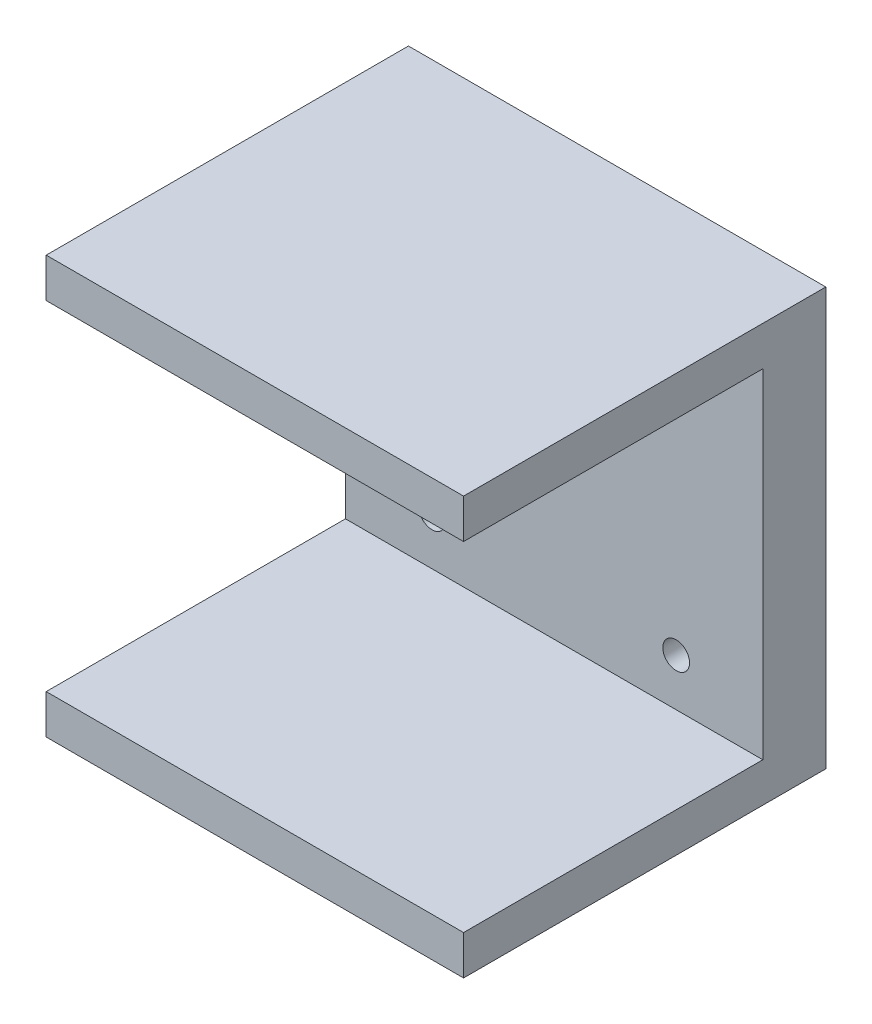
ISO-10303-21;
HEADER;
FILE_DESCRIPTION(('STEP AP214'),'2;1');
FILE_NAME('part.step','',(''),(''),'','','');
FILE_SCHEMA(('AUTOMOTIVE_DESIGN { 1 0 10303 214 1 1 1 1 }'));
ENDSEC;
DATA;
#1=APPLICATION_CONTEXT('core data for automotive mechanical design processes');
#2=APPLICATION_PROTOCOL_DEFINITION('international standard','automotive_design',2000,#1);
#3=PRODUCT_CONTEXT('',#1,'mechanical');
#4=PRODUCT('Part','Part','',(#3));
#5=PRODUCT_RELATED_PRODUCT_CATEGORY('part','',(#4));
#6=PRODUCT_DEFINITION_FORMATION('','',#4);
#7=PRODUCT_DEFINITION_CONTEXT('part definition',#1,'design');
#8=PRODUCT_DEFINITION('design','',#6,#7);
#9=PRODUCT_DEFINITION_SHAPE('','',#8);
#10=(LENGTH_UNIT() NAMED_UNIT(*) SI_UNIT(.MILLI.,.METRE.));
#11=(NAMED_UNIT(*) PLANE_ANGLE_UNIT() SI_UNIT($,.RADIAN.));
#12=(NAMED_UNIT(*) SI_UNIT($,.STERADIAN.) SOLID_ANGLE_UNIT());
#13=UNCERTAINTY_MEASURE_WITH_UNIT(LENGTH_MEASURE(1.E-05),#10,'distance_accuracy_value','');
#14=(GEOMETRIC_REPRESENTATION_CONTEXT(3) GLOBAL_UNCERTAINTY_ASSIGNED_CONTEXT((#13)) GLOBAL_UNIT_ASSIGNED_CONTEXT((#10,
#11,#12)) REPRESENTATION_CONTEXT('',''));
#15=CARTESIAN_POINT('',(0.,0.,0.));
#16=DIRECTION('',(0.,0.,1.));
#17=DIRECTION('',(1.,0.,0.));
#18=AXIS2_PLACEMENT_3D('',#15,#16,#17);
#19=CARTESIAN_POINT('',(0.,0.,0.));
#20=DIRECTION('',(0.,0.,-1.));
#21=DIRECTION('',(-1.,0.,0.));
#22=AXIS2_PLACEMENT_3D('',#19,#20,#21);
#23=PLANE('',#22);
#24=CARTESIAN_POINT('',(15.5,-15.5,0.));
#25=DIRECTION('',(0.,0.,-1.));
#26=DIRECTION('',(-1.,0.,0.));
#27=AXIS2_PLACEMENT_3D('',#24,#25,#26);
#28=CIRCLE('',#27,1.7);
#29=CARTESIAN_POINT('',(13.8,-15.5,0.));
#30=VERTEX_POINT('',#29);
#31=EDGE_CURVE('E157',#30,#30,#28,.T.);
#32=ORIENTED_EDGE('',*,*,#31,.F.);
#33=EDGE_LOOP('',(#32));
#34=FACE_BOUND('',#33,.T.);
#35=CARTESIAN_POINT('',(15.4999999999999,-15.4999999999999,0.));
#36=DIRECTION('',(0.,0.,1.));
#37=DIRECTION('',(-1.,0.,0.));
#38=AXIS2_PLACEMENT_3D('',#35,#36,#37);
#39=CIRCLE('',#38,2.94999999999999);
#40=CARTESIAN_POINT('',(12.5499999999999,-15.4999999999999,0.));
#41=VERTEX_POINT('',#40);
#42=EDGE_CURVE('E11',#41,#41,#39,.T.);
#43=ORIENTED_EDGE('',*,*,#42,.F.);
#44=EDGE_LOOP('',(#43));
#45=FACE_BOUND('',#44,.T.);
#46=ADVANCED_FACE('F42',(#34,#45),#23,.T.);
#47=CARTESIAN_POINT('',(-15.5,-15.5,0.));
#48=DIRECTION('',(0.,0.,-1.));
#49=DIRECTION('',(-1.,0.,0.));
#50=AXIS2_PLACEMENT_3D('',#47,#48,#49);
#51=CIRCLE('',#50,1.7);
#52=CARTESIAN_POINT('',(-17.2,-15.5,0.));
#53=VERTEX_POINT('',#52);
#54=EDGE_CURVE('E153',#53,#53,#51,.T.);
#55=ORIENTED_EDGE('',*,*,#54,.F.);
#56=EDGE_LOOP('',(#55));
#57=FACE_BOUND('',#56,.T.);
#58=CARTESIAN_POINT('',(-15.4999999999999,-15.4999999999999,0.));
#59=DIRECTION('',(0.,0.,1.));
#60=DIRECTION('',(-1.,0.,0.));
#61=AXIS2_PLACEMENT_3D('',#58,#59,#60);
#62=CIRCLE('',#61,2.95);
#63=CARTESIAN_POINT('',(-18.4499999999999,-15.4999999999999,0.));
#64=VERTEX_POINT('',#63);
#65=EDGE_CURVE('E52',#64,#64,#62,.T.);
#66=ORIENTED_EDGE('',*,*,#65,.F.);
#67=EDGE_LOOP('',(#66));
#68=FACE_BOUND('',#67,.T.);
#69=ADVANCED_FACE('F284',(#57,#68),#23,.T.);
#70=CARTESIAN_POINT('',(-15.5,15.5,0.));
#71=DIRECTION('',(0.,0.,-1.));
#72=DIRECTION('',(-1.,0.,0.));
#73=AXIS2_PLACEMENT_3D('',#70,#71,#72);
#74=CIRCLE('',#73,1.7);
#75=CARTESIAN_POINT('',(-17.2,15.5,0.));
#76=VERTEX_POINT('',#75);
#77=EDGE_CURVE('E158',#76,#76,#74,.T.);
#78=ORIENTED_EDGE('',*,*,#77,.F.);
#79=EDGE_LOOP('',(#78));
#80=FACE_BOUND('',#79,.T.);
#81=CARTESIAN_POINT('',(-15.4999999999999,15.4999999999999,0.));
#82=DIRECTION('',(0.,0.,1.));
#83=DIRECTION('',(1.,0.,0.));
#84=AXIS2_PLACEMENT_3D('',#81,#82,#83);
#85=CIRCLE('',#84,2.95);
#86=CARTESIAN_POINT('',(-12.5499999999999,15.4999999999999,0.));
#87=VERTEX_POINT('',#86);
#88=EDGE_CURVE('E247',#87,#87,#85,.T.);
#89=ORIENTED_EDGE('',*,*,#88,.F.);
#90=EDGE_LOOP('',(#89));
#91=FACE_BOUND('',#90,.T.);
#92=ADVANCED_FACE('F291',(#80,#91),#23,.T.);
#93=CARTESIAN_POINT('',(15.5,15.5,0.));
#94=DIRECTION('',(0.,0.,-1.));
#95=DIRECTION('',(-1.,0.,0.));
#96=AXIS2_PLACEMENT_3D('',#93,#94,#95);
#97=CIRCLE('',#96,1.7);
#98=CARTESIAN_POINT('',(13.8,15.5,0.));
#99=VERTEX_POINT('',#98);
#100=EDGE_CURVE('E162',#99,#99,#97,.T.);
#101=ORIENTED_EDGE('',*,*,#100,.F.);
#102=EDGE_LOOP('',(#101));
#103=FACE_BOUND('',#102,.T.);
#104=CARTESIAN_POINT('',(15.4999999999999,15.4999999999999,0.));
#105=DIRECTION('',(0.,0.,1.));
#106=DIRECTION('',(-1.,0.,0.));
#107=AXIS2_PLACEMENT_3D('',#104,#105,#106);
#108=CIRCLE('',#107,2.95);
#109=CARTESIAN_POINT('',(12.5499999999999,15.4999999999999,0.));
#110=VERTEX_POINT('',#109);
#111=EDGE_CURVE('E146',#110,#110,#108,.T.);
#112=ORIENTED_EDGE('',*,*,#111,.F.);
#113=EDGE_LOOP('',(#112));
#114=FACE_BOUND('',#113,.T.);
#115=ADVANCED_FACE('F287',(#103,#114),#23,.T.);
#116=CARTESIAN_POINT('',(26.5,-21.5,5.));
#117=DIRECTION('',(-1.,0.,0.));
#118=DIRECTION('',(0.,0.,1.));
#119=AXIS2_PLACEMENT_3D('',#116,#117,#118);
#120=PLANE('',#119);
#121=DIRECTION('',(0.,0.,-1.));
#122=VECTOR('',#121,1.);
#123=CARTESIAN_POINT('',(26.5,-26.5,43.));
#124=LINE('',#123,#122);
#125=CARTESIAN_POINT('',(26.5,-26.5,43.));
#126=VERTEX_POINT('',#125);
#127=CARTESIAN_POINT('',(26.4999999999998,-26.4999999999998,-3.));
#128=VERTEX_POINT('',#127);
#129=EDGE_CURVE('E136',#126,#128,#124,.T.);
#130=ORIENTED_EDGE('',*,*,#129,.T.);
#131=DIRECTION('',(0.,1.,0.));
#132=VECTOR('',#131,1.);
#133=CARTESIAN_POINT('',(26.4999999999998,26.4999999999998,-3.));
#134=LINE('',#133,#132);
#135=CARTESIAN_POINT('',(26.4999999999998,26.4999999999998,-3.));
#136=VERTEX_POINT('',#135);
#137=EDGE_CURVE('E129',#128,#136,#134,.T.);
#138=ORIENTED_EDGE('',*,*,#137,.T.);
#139=DIRECTION('',(0.,0.,-1.));
#140=VECTOR('',#139,1.);
#141=CARTESIAN_POINT('',(26.5,26.5,43.));
#142=LINE('',#141,#140);
#143=CARTESIAN_POINT('',(26.5,26.5,43.));
#144=VERTEX_POINT('',#143);
#145=EDGE_CURVE('E112',#144,#136,#142,.T.);
#146=ORIENTED_EDGE('',*,*,#145,.F.);
#147=DIRECTION('',(0.,1.,0.));
#148=VECTOR('',#147,1.);
#149=CARTESIAN_POINT('',(26.5,0.,43.));
#150=LINE('',#149,#148);
#151=CARTESIAN_POINT('',(26.5,21.5,43.));
#152=VERTEX_POINT('',#151);
#153=EDGE_CURVE('E220',#152,#144,#150,.T.);
#154=ORIENTED_EDGE('',*,*,#153,.F.);
#155=DIRECTION('',(0.,0.,-1.));
#156=VECTOR('',#155,1.);
#157=CARTESIAN_POINT('',(26.5,21.5,43.));
#158=LINE('',#157,#156);
#159=CARTESIAN_POINT('',(26.5,21.5,5.));
#160=VERTEX_POINT('',#159);
#161=EDGE_CURVE('E121',#152,#160,#158,.T.);
#162=ORIENTED_EDGE('',*,*,#161,.T.);
#163=DIRECTION('',(0.,1.,0.));
#164=VECTOR('',#163,1.);
#165=CARTESIAN_POINT('',(26.5,-21.5,5.));
#166=LINE('',#165,#164);
#167=CARTESIAN_POINT('',(26.5,-21.5,5.));
#168=VERTEX_POINT('',#167);
#169=EDGE_CURVE('E225',#168,#160,#166,.T.);
#170=ORIENTED_EDGE('',*,*,#169,.F.);
#171=DIRECTION('',(0.,0.,-1.));
#172=VECTOR('',#171,1.);
#173=CARTESIAN_POINT('',(26.5,-21.5,43.));
#174=LINE('',#173,#172);
#175=CARTESIAN_POINT('',(26.5,-21.5,43.));
#176=VERTEX_POINT('',#175);
#177=EDGE_CURVE('E60',#176,#168,#174,.T.);
#178=ORIENTED_EDGE('',*,*,#177,.F.);
#179=DIRECTION('',(0.,1.,0.));
#180=VECTOR('',#179,1.);
#181=CARTESIAN_POINT('',(26.5,0.,43.));
#182=LINE('',#181,#180);
#183=EDGE_CURVE('E196',#126,#176,#182,.T.);
#184=ORIENTED_EDGE('',*,*,#183,.F.);
#185=EDGE_LOOP('',(#130,#138,#146,#154,#162,#170,#178,#184));
#186=FACE_BOUND('',#185,.T.);
#187=ADVANCED_FACE('F44',(#186),#120,.F.);
#188=CARTESIAN_POINT('',(-26.5,-21.5,5.));
#189=DIRECTION('',(1.,0.,0.));
#190=DIRECTION('',(0.,0.,-1.));
#191=AXIS2_PLACEMENT_3D('',#188,#189,#190);
#192=PLANE('',#191);
#193=DIRECTION('',(0.,0.,-1.));
#194=VECTOR('',#193,1.);
#195=CARTESIAN_POINT('',(-26.5,26.5,43.));
#196=LINE('',#195,#194);
#197=CARTESIAN_POINT('',(-26.5,26.5,43.));
#198=VERTEX_POINT('',#197);
#199=CARTESIAN_POINT('',(-26.4999999999998,26.4999999999998,-3.));
#200=VERTEX_POINT('',#199);
#201=EDGE_CURVE('E122',#198,#200,#196,.T.);
#202=ORIENTED_EDGE('',*,*,#201,.T.);
#203=DIRECTION('',(0.,-1.,0.));
#204=VECTOR('',#203,1.);
#205=CARTESIAN_POINT('',(-26.4999999999998,26.4999999999998,-3.));
#206=LINE('',#205,#204);
#207=CARTESIAN_POINT('',(-26.4999999999998,-26.4999999999998,-3.));
#208=VERTEX_POINT('',#207);
#209=EDGE_CURVE('E132',#200,#208,#206,.T.);
#210=ORIENTED_EDGE('',*,*,#209,.T.);
#211=DIRECTION('',(0.,0.,-1.));
#212=VECTOR('',#211,1.);
#213=CARTESIAN_POINT('',(-26.5,-26.5,43.));
#214=LINE('',#213,#212);
#215=CARTESIAN_POINT('',(-26.5,-26.5,43.));
#216=VERTEX_POINT('',#215);
#217=EDGE_CURVE('E199',#216,#208,#214,.T.);
#218=ORIENTED_EDGE('',*,*,#217,.F.);
#219=DIRECTION('',(0.,1.,0.));
#220=VECTOR('',#219,1.);
#221=CARTESIAN_POINT('',(-26.5,0.,43.));
#222=LINE('',#221,#220);
#223=CARTESIAN_POINT('',(-26.5,-21.5,43.));
#224=VERTEX_POINT('',#223);
#225=EDGE_CURVE('E189',#216,#224,#222,.T.);
#226=ORIENTED_EDGE('',*,*,#225,.T.);
#227=DIRECTION('',(0.,0.,-1.));
#228=VECTOR('',#227,1.);
#229=CARTESIAN_POINT('',(-26.5,-21.5,43.));
#230=LINE('',#229,#228);
#231=CARTESIAN_POINT('',(-26.5,-21.5,5.));
#232=VERTEX_POINT('',#231);
#233=EDGE_CURVE('E205',#224,#232,#230,.T.);
#234=ORIENTED_EDGE('',*,*,#233,.T.);
#235=DIRECTION('',(0.,-1.,0.));
#236=VECTOR('',#235,1.);
#237=CARTESIAN_POINT('',(-26.5,-21.5,5.));
#238=LINE('',#237,#236);
#239=CARTESIAN_POINT('',(-26.5,21.5,5.));
#240=VERTEX_POINT('',#239);
#241=EDGE_CURVE('E236',#240,#232,#238,.T.);
#242=ORIENTED_EDGE('',*,*,#241,.F.);
#243=DIRECTION('',(0.,0.,-1.));
#244=VECTOR('',#243,1.);
#245=CARTESIAN_POINT('',(-26.5,21.5,43.));
#246=LINE('',#245,#244);
#247=CARTESIAN_POINT('',(-26.5,21.5,43.));
#248=VERTEX_POINT('',#247);
#249=EDGE_CURVE('E68',#248,#240,#246,.T.);
#250=ORIENTED_EDGE('',*,*,#249,.F.);
#251=DIRECTION('',(0.,1.,0.));
#252=VECTOR('',#251,1.);
#253=CARTESIAN_POINT('',(-26.5,0.,43.));
#254=LINE('',#253,#252);
#255=EDGE_CURVE('E214',#248,#198,#254,.T.);
#256=ORIENTED_EDGE('',*,*,#255,.T.);
#257=EDGE_LOOP('',(#202,#210,#218,#226,#234,#242,#250,#256));
#258=FACE_BOUND('',#257,.T.);
#259=ADVANCED_FACE('F301',(#258),#192,.F.);
#260=CARTESIAN_POINT('',(0.,0.,5.));
#261=DIRECTION('',(0.,0.,-1.));
#262=DIRECTION('',(-1.,0.,0.));
#263=AXIS2_PLACEMENT_3D('',#260,#261,#262);
#264=PLANE('',#263);
#265=CARTESIAN_POINT('',(-15.5,15.5,5.));
#266=DIRECTION('',(0.,0.,-1.));
#267=DIRECTION('',(-1.,0.,0.));
#268=AXIS2_PLACEMENT_3D('',#265,#266,#267);
#269=CIRCLE('',#268,1.7);
#270=CARTESIAN_POINT('',(-17.2,15.5,5.));
#271=VERTEX_POINT('',#270);
#272=EDGE_CURVE('E181',#271,#271,#269,.T.);
#273=ORIENTED_EDGE('',*,*,#272,.T.);
#274=EDGE_LOOP('',(#273));
#275=FACE_BOUND('',#274,.T.);
#276=CARTESIAN_POINT('',(15.5,-15.5,5.));
#277=DIRECTION('',(0.,0.,-1.));
#278=DIRECTION('',(-1.,0.,0.));
#279=AXIS2_PLACEMENT_3D('',#276,#277,#278);
#280=CIRCLE('',#279,1.7);
#281=CARTESIAN_POINT('',(13.8,-15.5,5.));
#282=VERTEX_POINT('',#281);
#283=EDGE_CURVE('E177',#282,#282,#280,.T.);
#284=ORIENTED_EDGE('',*,*,#283,.T.);
#285=EDGE_LOOP('',(#284));
#286=FACE_BOUND('',#285,.T.);
#287=CARTESIAN_POINT('',(-15.5,-15.5,5.));
#288=DIRECTION('',(0.,0.,-1.));
#289=DIRECTION('',(-1.,0.,0.));
#290=AXIS2_PLACEMENT_3D('',#287,#288,#289);
#291=CIRCLE('',#290,1.7);
#292=CARTESIAN_POINT('',(-17.2,-15.5,5.));
#293=VERTEX_POINT('',#292);
#294=EDGE_CURVE('E173',#293,#293,#291,.T.);
#295=ORIENTED_EDGE('',*,*,#294,.T.);
#296=EDGE_LOOP('',(#295));
#297=FACE_BOUND('',#296,.T.);
#298=CARTESIAN_POINT('',(15.5,15.5,5.));
#299=DIRECTION('',(0.,0.,-1.));
#300=DIRECTION('',(-1.,0.,0.));
#301=AXIS2_PLACEMENT_3D('',#298,#299,#300);
#302=CIRCLE('',#301,1.7);
#303=CARTESIAN_POINT('',(13.8,15.5,5.));
#304=VERTEX_POINT('',#303);
#305=EDGE_CURVE('E169',#304,#304,#302,.T.);
#306=ORIENTED_EDGE('',*,*,#305,.T.);
#307=EDGE_LOOP('',(#306));
#308=FACE_BOUND('',#307,.T.);
#309=ORIENTED_EDGE('',*,*,#169,.T.);
#310=DIRECTION('',(-1.,0.,0.));
#311=VECTOR('',#310,1.);
#312=CARTESIAN_POINT('',(-26.5,21.5,5.));
#313=LINE('',#312,#311);
#314=EDGE_CURVE('E234',#160,#240,#313,.T.);
#315=ORIENTED_EDGE('',*,*,#314,.T.);
#316=ORIENTED_EDGE('',*,*,#241,.T.);
#317=DIRECTION('',(1.,0.,0.));
#318=VECTOR('',#317,1.);
#319=CARTESIAN_POINT('',(-26.5,-21.5,5.));
#320=LINE('',#319,#318);
#321=EDGE_CURVE('E46',#232,#168,#320,.T.);
#322=ORIENTED_EDGE('',*,*,#321,.T.);
#323=EDGE_LOOP('',(#309,#315,#316,#322));
#324=FACE_BOUND('',#323,.T.);
#325=ADVANCED_FACE('F314',(#275,#286,#297,#308,#324),#264,.F.);
#326=CARTESIAN_POINT('',(0.,21.5,43.));
#327=DIRECTION('',(0.,1.,0.));
#328=DIRECTION('',(0.,0.,1.));
#329=AXIS2_PLACEMENT_3D('',#326,#327,#328);
#330=PLANE('',#329);
#331=ORIENTED_EDGE('',*,*,#314,.F.);
#332=ORIENTED_EDGE('',*,*,#161,.F.);
#333=DIRECTION('',(1.,0.,0.));
#334=VECTOR('',#333,1.);
#335=CARTESIAN_POINT('',(0.,21.5,43.));
#336=LINE('',#335,#334);
#337=EDGE_CURVE('E202',#248,#152,#336,.T.);
#338=ORIENTED_EDGE('',*,*,#337,.F.);
#339=ORIENTED_EDGE('',*,*,#249,.T.);
#340=EDGE_LOOP('',(#331,#332,#338,#339));
#341=FACE_BOUND('',#340,.T.);
#342=ADVANCED_FACE('F316',(#341),#330,.F.);
#343=CARTESIAN_POINT('',(0.,26.5,43.));
#344=DIRECTION('',(0.,-1.,0.));
#345=DIRECTION('',(0.,0.,-1.));
#346=AXIS2_PLACEMENT_3D('',#343,#344,#345);
#347=PLANE('',#346);
#348=ORIENTED_EDGE('',*,*,#145,.T.);
#349=DIRECTION('',(-1.,0.,0.));
#350=VECTOR('',#349,1.);
#351=CARTESIAN_POINT('',(-26.4999999999998,26.4999999999998,-3.));
#352=LINE('',#351,#350);
#353=EDGE_CURVE('E116',#136,#200,#352,.T.);
#354=ORIENTED_EDGE('',*,*,#353,.T.);
#355=ORIENTED_EDGE('',*,*,#201,.F.);
#356=DIRECTION('',(-1.,0.,0.));
#357=VECTOR('',#356,1.);
#358=CARTESIAN_POINT('',(0.,26.5,43.));
#359=LINE('',#358,#357);
#360=EDGE_CURVE('E117',#144,#198,#359,.T.);
#361=ORIENTED_EDGE('',*,*,#360,.F.);
#362=EDGE_LOOP('',(#348,#354,#355,#361));
#363=FACE_BOUND('',#362,.T.);
#364=ADVANCED_FACE('F114',(#363),#347,.F.);
#365=CARTESIAN_POINT('',(0.,0.,43.));
#366=DIRECTION('',(0.,0.,-1.));
#367=DIRECTION('',(-1.,0.,0.));
#368=AXIS2_PLACEMENT_3D('',#365,#366,#367);
#369=PLANE('',#368);
#370=ORIENTED_EDGE('',*,*,#337,.T.);
#371=ORIENTED_EDGE('',*,*,#153,.T.);
#372=ORIENTED_EDGE('',*,*,#360,.T.);
#373=ORIENTED_EDGE('',*,*,#255,.F.);
#374=EDGE_LOOP('',(#370,#371,#372,#373));
#375=FACE_BOUND('',#374,.T.);
#376=ADVANCED_FACE('F321',(#375),#369,.F.);
#377=CARTESIAN_POINT('',(0.,-26.5,43.));
#378=DIRECTION('',(0.,-1.,0.));
#379=DIRECTION('',(0.,0.,-1.));
#380=AXIS2_PLACEMENT_3D('',#377,#378,#379);
#381=PLANE('',#380);
#382=ORIENTED_EDGE('',*,*,#217,.T.);
#383=DIRECTION('',(1.,0.,0.));
#384=VECTOR('',#383,1.);
#385=CARTESIAN_POINT('',(-26.4999999999998,-26.4999999999998,-3.));
#386=LINE('',#385,#384);
#387=EDGE_CURVE('E150',#208,#128,#386,.T.);
#388=ORIENTED_EDGE('',*,*,#387,.T.);
#389=ORIENTED_EDGE('',*,*,#129,.F.);
#390=DIRECTION('',(-1.,0.,0.));
#391=VECTOR('',#390,1.);
#392=CARTESIAN_POINT('',(0.,-26.5,43.));
#393=LINE('',#392,#391);
#394=EDGE_CURVE('E185',#126,#216,#393,.T.);
#395=ORIENTED_EDGE('',*,*,#394,.T.);
#396=EDGE_LOOP('',(#382,#388,#389,#395));
#397=FACE_BOUND('',#396,.T.);
#398=ADVANCED_FACE('F329',(#397),#381,.T.);
#399=CARTESIAN_POINT('',(0.,-21.5,43.));
#400=DIRECTION('',(0.,-1.,0.));
#401=DIRECTION('',(0.,0.,-1.));
#402=AXIS2_PLACEMENT_3D('',#399,#400,#401);
#403=PLANE('',#402);
#404=ORIENTED_EDGE('',*,*,#321,.F.);
#405=ORIENTED_EDGE('',*,*,#233,.F.);
#406=DIRECTION('',(-1.,0.,0.));
#407=VECTOR('',#406,1.);
#408=CARTESIAN_POINT('',(0.,-21.5,43.));
#409=LINE('',#408,#407);
#410=EDGE_CURVE('E193',#176,#224,#409,.T.);
#411=ORIENTED_EDGE('',*,*,#410,.F.);
#412=ORIENTED_EDGE('',*,*,#177,.T.);
#413=EDGE_LOOP('',(#404,#405,#411,#412));
#414=FACE_BOUND('',#413,.T.);
#415=ADVANCED_FACE('F325',(#414),#403,.F.);
#416=CARTESIAN_POINT('',(0.,0.,43.));
#417=DIRECTION('',(0.,0.,-1.));
#418=DIRECTION('',(-1.,0.,0.));
#419=AXIS2_PLACEMENT_3D('',#416,#417,#418);
#420=PLANE('',#419);
#421=ORIENTED_EDGE('',*,*,#394,.F.);
#422=ORIENTED_EDGE('',*,*,#183,.T.);
#423=ORIENTED_EDGE('',*,*,#410,.T.);
#424=ORIENTED_EDGE('',*,*,#225,.F.);
#425=EDGE_LOOP('',(#421,#422,#423,#424));
#426=FACE_BOUND('',#425,.T.);
#427=ADVANCED_FACE('F310',(#426),#420,.F.);
#428=CARTESIAN_POINT('',(15.5,15.5,43.));
#429=DIRECTION('',(0.,0.,-1.));
#430=DIRECTION('',(-1.,0.,0.));
#431=AXIS2_PLACEMENT_3D('',#428,#429,#430);
#432=CYLINDRICAL_SURFACE('',#431,1.7);
#433=ORIENTED_EDGE('',*,*,#100,.T.);
#434=EDGE_LOOP('',(#433));
#435=FACE_BOUND('',#434,.T.);
#436=ORIENTED_EDGE('',*,*,#305,.F.);
#437=EDGE_LOOP('',(#436));
#438=FACE_BOUND('',#437,.T.);
#439=ADVANCED_FACE('F306',(#435,#438),#432,.F.);
#440=CARTESIAN_POINT('',(-15.5,-15.5,43.));
#441=DIRECTION('',(0.,0.,-1.));
#442=DIRECTION('',(-1.,0.,0.));
#443=AXIS2_PLACEMENT_3D('',#440,#441,#442);
#444=CYLINDRICAL_SURFACE('',#443,1.7);
#445=ORIENTED_EDGE('',*,*,#54,.T.);
#446=EDGE_LOOP('',(#445));
#447=FACE_BOUND('',#446,.T.);
#448=ORIENTED_EDGE('',*,*,#294,.F.);
#449=EDGE_LOOP('',(#448));
#450=FACE_BOUND('',#449,.T.);
#451=ADVANCED_FACE('F309',(#447,#450),#444,.F.);
#452=CARTESIAN_POINT('',(15.5,-15.5,43.));
#453=DIRECTION('',(0.,0.,-1.));
#454=DIRECTION('',(-1.,0.,0.));
#455=AXIS2_PLACEMENT_3D('',#452,#453,#454);
#456=CYLINDRICAL_SURFACE('',#455,1.7);
#457=ORIENTED_EDGE('',*,*,#31,.T.);
#458=EDGE_LOOP('',(#457));
#459=FACE_BOUND('',#458,.T.);
#460=ORIENTED_EDGE('',*,*,#283,.F.);
#461=EDGE_LOOP('',(#460));
#462=FACE_BOUND('',#461,.T.);
#463=ADVANCED_FACE('F390',(#459,#462),#456,.F.);
#464=CARTESIAN_POINT('',(-15.5,15.5,43.));
#465=DIRECTION('',(0.,0.,-1.));
#466=DIRECTION('',(-1.,0.,0.));
#467=AXIS2_PLACEMENT_3D('',#464,#465,#466);
#468=CYLINDRICAL_SURFACE('',#467,1.7);
#469=ORIENTED_EDGE('',*,*,#77,.T.);
#470=EDGE_LOOP('',(#469));
#471=FACE_BOUND('',#470,.T.);
#472=ORIENTED_EDGE('',*,*,#272,.F.);
#473=EDGE_LOOP('',(#472));
#474=FACE_BOUND('',#473,.T.);
#475=ADVANCED_FACE('F400',(#471,#474),#468,.F.);
#476=CARTESIAN_POINT('',(0.,0.,-3.));
#477=DIRECTION('',(0.,0.,1.));
#478=DIRECTION('',(1.,0.,0.));
#479=AXIS2_PLACEMENT_3D('',#476,#477,#478);
#480=PLANE('',#479);
#481=CARTESIAN_POINT('',(15.4999999999999,-15.4999999999999,-3.));
#482=DIRECTION('',(0.,0.,1.));
#483=DIRECTION('',(-1.,0.,0.));
#484=AXIS2_PLACEMENT_3D('',#481,#482,#483);
#485=CIRCLE('',#484,2.94999999999999);
#486=CARTESIAN_POINT('',(12.5499999999999,-15.4999999999999,-3.));
#487=VERTEX_POINT('',#486);
#488=EDGE_CURVE('E267',#487,#487,#485,.T.);
#489=ORIENTED_EDGE('',*,*,#488,.T.);
#490=EDGE_LOOP('',(#489));
#491=FACE_BOUND('',#490,.T.);
#492=CARTESIAN_POINT('',(-15.4999999999999,-15.4999999999999,-3.));
#493=DIRECTION('',(0.,0.,1.));
#494=DIRECTION('',(-1.,0.,0.));
#495=AXIS2_PLACEMENT_3D('',#492,#493,#494);
#496=CIRCLE('',#495,2.95);
#497=CARTESIAN_POINT('',(-18.4499999999999,-15.4999999999999,-3.));
#498=VERTEX_POINT('',#497);
#499=EDGE_CURVE('E263',#498,#498,#496,.T.);
#500=ORIENTED_EDGE('',*,*,#499,.T.);
#501=EDGE_LOOP('',(#500));
#502=FACE_BOUND('',#501,.T.);
#503=CARTESIAN_POINT('',(-15.4999999999999,15.4999999999999,-3.));
#504=DIRECTION('',(0.,0.,1.));
#505=DIRECTION('',(1.,0.,0.));
#506=AXIS2_PLACEMENT_3D('',#503,#504,#505);
#507=CIRCLE('',#506,2.95);
#508=CARTESIAN_POINT('',(-12.5499999999999,15.4999999999999,-3.));
#509=VERTEX_POINT('',#508);
#510=EDGE_CURVE('E143',#509,#509,#507,.T.);
#511=ORIENTED_EDGE('',*,*,#510,.T.);
#512=EDGE_LOOP('',(#511));
#513=FACE_BOUND('',#512,.T.);
#514=CARTESIAN_POINT('',(15.4999999999999,15.4999999999999,-3.));
#515=DIRECTION('',(0.,0.,1.));
#516=DIRECTION('',(-1.,0.,0.));
#517=AXIS2_PLACEMENT_3D('',#514,#515,#516);
#518=CIRCLE('',#517,2.95);
#519=CARTESIAN_POINT('',(12.5499999999999,15.4999999999999,-3.));
#520=VERTEX_POINT('',#519);
#521=EDGE_CURVE('E138',#520,#520,#518,.T.);
#522=ORIENTED_EDGE('',*,*,#521,.T.);
#523=EDGE_LOOP('',(#522));
#524=FACE_BOUND('',#523,.T.);
#525=ORIENTED_EDGE('',*,*,#137,.F.);
#526=ORIENTED_EDGE('',*,*,#387,.F.);
#527=ORIENTED_EDGE('',*,*,#209,.F.);
#528=ORIENTED_EDGE('',*,*,#353,.F.);
#529=EDGE_LOOP('',(#525,#526,#527,#528));
#530=FACE_BOUND('',#529,.T.);
#531=ADVANCED_FACE('F127',(#491,#502,#513,#524,#530),#480,.F.);
#532=CARTESIAN_POINT('',(15.4999999999999,15.4999999999999,-3.));
#533=DIRECTION('',(0.,0.,1.));
#534=DIRECTION('',(1.,0.,0.));
#535=AXIS2_PLACEMENT_3D('',#532,#533,#534);
#536=CYLINDRICAL_SURFACE('',#535,2.95);
#537=ORIENTED_EDGE('',*,*,#521,.F.);
#538=EDGE_LOOP('',(#537));
#539=FACE_BOUND('',#538,.T.);
#540=ORIENTED_EDGE('',*,*,#111,.T.);
#541=EDGE_LOOP('',(#540));
#542=FACE_BOUND('',#541,.T.);
#543=ADVANCED_FACE('F419',(#539,#542),#536,.F.);
#544=CARTESIAN_POINT('',(-15.4999999999999,15.4999999999999,-3.));
#545=DIRECTION('',(0.,0.,1.));
#546=DIRECTION('',(1.,0.,0.));
#547=AXIS2_PLACEMENT_3D('',#544,#545,#546);
#548=CYLINDRICAL_SURFACE('',#547,2.95);
#549=ORIENTED_EDGE('',*,*,#510,.F.);
#550=EDGE_LOOP('',(#549));
#551=FACE_BOUND('',#550,.T.);
#552=ORIENTED_EDGE('',*,*,#88,.T.);
#553=EDGE_LOOP('',(#552));
#554=FACE_BOUND('',#553,.T.);
#555=ADVANCED_FACE('F428',(#551,#554),#548,.F.);
#556=CARTESIAN_POINT('',(-15.4999999999999,-15.4999999999999,-3.));
#557=DIRECTION('',(0.,0.,1.));
#558=DIRECTION('',(1.,0.,0.));
#559=AXIS2_PLACEMENT_3D('',#556,#557,#558);
#560=CYLINDRICAL_SURFACE('',#559,2.95);
#561=ORIENTED_EDGE('',*,*,#499,.F.);
#562=EDGE_LOOP('',(#561));
#563=FACE_BOUND('',#562,.T.);
#564=ORIENTED_EDGE('',*,*,#65,.T.);
#565=EDGE_LOOP('',(#564));
#566=FACE_BOUND('',#565,.T.);
#567=ADVANCED_FACE('F279',(#563,#566),#560,.F.);
#568=CARTESIAN_POINT('',(15.4999999999999,-15.4999999999999,-3.));
#569=DIRECTION('',(0.,0.,1.));
#570=DIRECTION('',(1.,0.,0.));
#571=AXIS2_PLACEMENT_3D('',#568,#569,#570);
#572=CYLINDRICAL_SURFACE('',#571,2.94999999999999);
#573=ORIENTED_EDGE('',*,*,#488,.F.);
#574=EDGE_LOOP('',(#573));
#575=FACE_BOUND('',#574,.T.);
#576=ORIENTED_EDGE('',*,*,#42,.T.);
#577=EDGE_LOOP('',(#576));
#578=FACE_BOUND('',#577,.T.);
#579=ADVANCED_FACE('F276',(#575,#578),#572,.F.);
#580=CLOSED_SHELL('',(#46,#69,#92,#115,#187,#259,#325,#342,#364,#376,#398,#415,#427,#439,#451,
#463,#475,#531,#543,#555,#567,#579));
#581=MANIFOLD_SOLID_BREP('B2',#580);
#582=ADVANCED_BREP_SHAPE_REPRESENTATION('',(#18,#581),#14);
#583=SHAPE_DEFINITION_REPRESENTATION(#9,#582);
ENDSEC;
END-ISO-10303-21;
